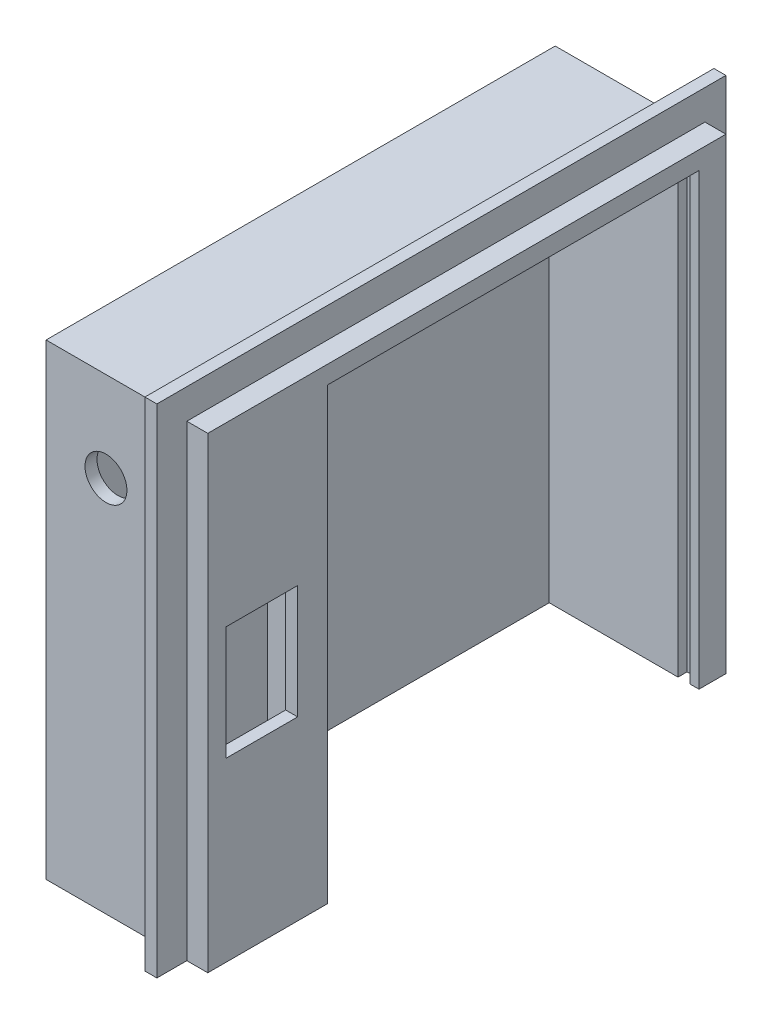
ISO-10303-21;
HEADER;
FILE_DESCRIPTION(('STEP AP214'),'2;1');
FILE_NAME('part.step','',(''),(''),'','','');
FILE_SCHEMA(('AUTOMOTIVE_DESIGN { 1 0 10303 214 1 1 1 1 }'));
ENDSEC;
DATA;
#1=APPLICATION_CONTEXT('core data for automotive mechanical design processes');
#2=APPLICATION_PROTOCOL_DEFINITION('international standard','automotive_design',2000,#1);
#3=PRODUCT_CONTEXT('',#1,'mechanical');
#4=PRODUCT('Part','Part','',(#3));
#5=PRODUCT_RELATED_PRODUCT_CATEGORY('part','',(#4));
#6=PRODUCT_DEFINITION_FORMATION('','',#4);
#7=PRODUCT_DEFINITION_CONTEXT('part definition',#1,'design');
#8=PRODUCT_DEFINITION('design','',#6,#7);
#9=PRODUCT_DEFINITION_SHAPE('','',#8);
#10=(LENGTH_UNIT() NAMED_UNIT(*) SI_UNIT(.MILLI.,.METRE.));
#11=(NAMED_UNIT(*) PLANE_ANGLE_UNIT() SI_UNIT($,.RADIAN.));
#12=(NAMED_UNIT(*) SI_UNIT($,.STERADIAN.) SOLID_ANGLE_UNIT());
#13=UNCERTAINTY_MEASURE_WITH_UNIT(LENGTH_MEASURE(1.E-05),#10,'distance_accuracy_value','');
#14=(GEOMETRIC_REPRESENTATION_CONTEXT(3) GLOBAL_UNCERTAINTY_ASSIGNED_CONTEXT((#13)) GLOBAL_UNIT_ASSIGNED_CONTEXT((#10,
#11,#12)) REPRESENTATION_CONTEXT('',''));
#15=CARTESIAN_POINT('',(0.,0.,0.));
#16=DIRECTION('',(0.,0.,1.));
#17=DIRECTION('',(1.,0.,0.));
#18=AXIS2_PLACEMENT_3D('',#15,#16,#17);
#19=CARTESIAN_POINT('',(23.5,0.,95.));
#20=DIRECTION('',(1.,0.,0.));
#21=DIRECTION('',(0.,0.,1.));
#22=AXIS2_PLACEMENT_3D('',#19,#20,#21);
#23=PLANE('',#22);
#24=DIRECTION('',(0.,0.,1.));
#25=VECTOR('',#24,1.);
#26=CARTESIAN_POINT('',(23.5,40.,52.5));
#27=LINE('',#26,#25);
#28=CARTESIAN_POINT('',(23.5,40.,51.));
#29=VERTEX_POINT('',#28);
#30=CARTESIAN_POINT('',(23.5,40.,137.5));
#31=VERTEX_POINT('',#30);
#32=EDGE_CURVE('E55',#29,#31,#27,.T.);
#33=ORIENTED_EDGE('',*,*,#32,.F.);
#34=DIRECTION('',(0.,1.,0.));
#35=VECTOR('',#34,1.);
#36=CARTESIAN_POINT('',(23.5,40.,51.));
#37=LINE('',#36,#35);
#38=CARTESIAN_POINT('',(23.5,-38.,51.));
#39=VERTEX_POINT('',#38);
#40=EDGE_CURVE('E276',#39,#29,#37,.T.);
#41=ORIENTED_EDGE('',*,*,#40,.F.);
#42=DIRECTION('',(0.,0.,1.));
#43=VECTOR('',#42,1.);
#44=CARTESIAN_POINT('',(23.5,-38.,47.5));
#45=LINE('',#44,#43);
#46=CARTESIAN_POINT('',(23.5,-38.,47.5));
#47=VERTEX_POINT('',#46);
#48=EDGE_CURVE('E288',#47,#39,#45,.T.);
#49=ORIENTED_EDGE('',*,*,#48,.F.);
#50=DIRECTION('',(0.,-1.,0.));
#51=VECTOR('',#50,1.);
#52=CARTESIAN_POINT('',(23.5,45.,47.5));
#53=LINE('',#52,#51);
#54=CARTESIAN_POINT('',(23.5,45.,47.5));
#55=VERTEX_POINT('',#54);
#56=EDGE_CURVE('E285',#55,#47,#53,.T.);
#57=ORIENTED_EDGE('',*,*,#56,.F.);
#58=DIRECTION('',(0.,0.,-1.));
#59=VECTOR('',#58,1.);
#60=CARTESIAN_POINT('',(23.5,45.,47.5));
#61=LINE('',#60,#59);
#62=CARTESIAN_POINT('',(23.5,45.,142.5));
#63=VERTEX_POINT('',#62);
#64=EDGE_CURVE('E299',#63,#55,#61,.T.);
#65=ORIENTED_EDGE('',*,*,#64,.F.);
#66=DIRECTION('',(0.,1.,0.));
#67=VECTOR('',#66,1.);
#68=CARTESIAN_POINT('',(23.5,45.,142.5));
#69=LINE('',#68,#67);
#70=CARTESIAN_POINT('',(23.5,-38.,142.5));
#71=VERTEX_POINT('',#70);
#72=EDGE_CURVE('E334',#71,#63,#69,.T.);
#73=ORIENTED_EDGE('',*,*,#72,.F.);
#74=DIRECTION('',(0.,0.,1.));
#75=VECTOR('',#74,1.);
#76=CARTESIAN_POINT('',(23.5,-38.,137.5));
#77=LINE('',#76,#75);
#78=CARTESIAN_POINT('',(23.5,-38.,137.5));
#79=VERTEX_POINT('',#78);
#80=EDGE_CURVE('E330',#79,#71,#77,.T.);
#81=ORIENTED_EDGE('',*,*,#80,.F.);
#82=DIRECTION('',(0.,-1.,0.));
#83=VECTOR('',#82,1.);
#84=CARTESIAN_POINT('',(23.5,40.,137.5));
#85=LINE('',#84,#83);
#86=EDGE_CURVE('E326',#31,#79,#85,.T.);
#87=ORIENTED_EDGE('',*,*,#86,.F.);
#88=EDGE_LOOP('',(#33,#41,#49,#57,#65,#73,#81,#87));
#89=FACE_BOUND('',#88,.T.);
#90=ADVANCED_FACE('F39',(#89),#23,.T.);
#91=CARTESIAN_POINT('',(27.,40.,137.5));
#92=DIRECTION('',(0.,0.,-1.));
#93=DIRECTION('',(0.,-1.,0.));
#94=AXIS2_PLACEMENT_3D('',#91,#92,#93);
#95=PLANE('',#94);
#96=CARTESIAN_POINT('',(10.,25.,137.5));
#97=DIRECTION('',(0.,0.,-1.));
#98=DIRECTION('',(0.,1.,0.));
#99=AXIS2_PLACEMENT_3D('',#96,#97,#98);
#100=CIRCLE('',#99,3.5);
#101=CARTESIAN_POINT('',(10.,28.5,137.5));
#102=VERTEX_POINT('',#101);
#103=EDGE_CURVE('E343',#102,#102,#100,.T.);
#104=ORIENTED_EDGE('',*,*,#103,.T.);
#105=EDGE_LOOP('',(#104));
#106=FACE_BOUND('',#105,.T.);
#107=DIRECTION('',(0.,-1.,0.));
#108=VECTOR('',#107,1.);
#109=CARTESIAN_POINT('',(21.5,40.,137.5));
#110=LINE('',#109,#108);
#111=CARTESIAN_POINT('',(21.5,40.,137.5));
#112=VERTEX_POINT('',#111);
#113=CARTESIAN_POINT('',(21.5,-38.,137.5));
#114=VERTEX_POINT('',#113);
#115=EDGE_CURVE('E307',#112,#114,#110,.T.);
#116=ORIENTED_EDGE('',*,*,#115,.F.);
#117=DIRECTION('',(-1.,0.,0.));
#118=VECTOR('',#117,1.);
#119=CARTESIAN_POINT('',(27.,40.,137.5));
#120=LINE('',#119,#118);
#121=CARTESIAN_POINT('',(0.,40.,137.5));
#122=VERTEX_POINT('',#121);
#123=EDGE_CURVE('E579',#112,#122,#120,.T.);
#124=ORIENTED_EDGE('',*,*,#123,.T.);
#125=DIRECTION('',(0.,1.,0.));
#126=VECTOR('',#125,1.);
#127=CARTESIAN_POINT('',(0.,40.,137.5));
#128=LINE('',#127,#126);
#129=CARTESIAN_POINT('',(0.,-38.,137.5));
#130=VERTEX_POINT('',#129);
#131=EDGE_CURVE('E526',#130,#122,#128,.T.);
#132=ORIENTED_EDGE('',*,*,#131,.F.);
#133=DIRECTION('',(1.,0.,0.));
#134=VECTOR('',#133,1.);
#135=CARTESIAN_POINT('',(0.,-38.,137.5));
#136=LINE('',#135,#134);
#137=EDGE_CURVE('E514',#130,#114,#136,.T.);
#138=ORIENTED_EDGE('',*,*,#137,.T.);
#139=EDGE_LOOP('',(#116,#124,#132,#138));
#140=FACE_BOUND('',#139,.T.);
#141=ADVANCED_FACE('F640',(#106,#140),#95,.F.);
#142=CARTESIAN_POINT('',(27.,40.,52.5));
#143=DIRECTION('',(0.,-1.,0.));
#144=DIRECTION('',(0.,0.,1.));
#145=AXIS2_PLACEMENT_3D('',#142,#143,#144);
#146=PLANE('',#145);
#147=DIRECTION('',(0.,0.,1.));
#148=VECTOR('',#147,1.);
#149=CARTESIAN_POINT('',(21.5,40.,52.5));
#150=LINE('',#149,#148);
#151=CARTESIAN_POINT('',(21.5,40.,52.5));
#152=VERTEX_POINT('',#151);
#153=EDGE_CURVE('E63',#152,#112,#150,.T.);
#154=ORIENTED_EDGE('',*,*,#153,.F.);
#155=DIRECTION('',(-1.,0.,0.));
#156=VECTOR('',#155,1.);
#157=CARTESIAN_POINT('',(27.,40.,52.5));
#158=LINE('',#157,#156);
#159=CARTESIAN_POINT('',(0.,40.,52.5));
#160=VERTEX_POINT('',#159);
#161=EDGE_CURVE('E268',#152,#160,#158,.T.);
#162=ORIENTED_EDGE('',*,*,#161,.T.);
#163=DIRECTION('',(0.,0.,-1.));
#164=VECTOR('',#163,1.);
#165=CARTESIAN_POINT('',(0.,40.,52.5));
#166=LINE('',#165,#164);
#167=EDGE_CURVE('E569',#122,#160,#166,.T.);
#168=ORIENTED_EDGE('',*,*,#167,.F.);
#169=ORIENTED_EDGE('',*,*,#123,.F.);
#170=EDGE_LOOP('',(#154,#162,#168,#169));
#171=FACE_BOUND('',#170,.T.);
#172=ADVANCED_FACE('F647',(#171),#146,.F.);
#173=CARTESIAN_POINT('',(27.,40.,52.5));
#174=DIRECTION('',(0.,0.,1.));
#175=DIRECTION('',(-1.,0.,0.));
#176=AXIS2_PLACEMENT_3D('',#173,#174,#175);
#177=PLANE('',#176);
#178=DIRECTION('',(0.,1.,0.));
#179=VECTOR('',#178,1.);
#180=CARTESIAN_POINT('',(21.5,-38.,52.5));
#181=LINE('',#180,#179);
#182=CARTESIAN_POINT('',(21.5,-38.,52.5));
#183=VERTEX_POINT('',#182);
#184=EDGE_CURVE('E302',#183,#152,#181,.T.);
#185=ORIENTED_EDGE('',*,*,#184,.F.);
#186=DIRECTION('',(1.,0.,0.));
#187=VECTOR('',#186,1.);
#188=CARTESIAN_POINT('',(0.,-38.,52.5));
#189=LINE('',#188,#187);
#190=CARTESIAN_POINT('',(0.,-38.,52.5));
#191=VERTEX_POINT('',#190);
#192=EDGE_CURVE('E509',#191,#183,#189,.T.);
#193=ORIENTED_EDGE('',*,*,#192,.F.);
#194=DIRECTION('',(0.,-1.,0.));
#195=VECTOR('',#194,1.);
#196=CARTESIAN_POINT('',(0.,40.,52.5));
#197=LINE('',#196,#195);
#198=EDGE_CURVE('E564',#160,#191,#197,.T.);
#199=ORIENTED_EDGE('',*,*,#198,.F.);
#200=ORIENTED_EDGE('',*,*,#161,.F.);
#201=EDGE_LOOP('',(#185,#193,#199,#200));
#202=FACE_BOUND('',#201,.T.);
#203=ADVANCED_FACE('F738',(#202),#177,.F.);
#204=CARTESIAN_POINT('',(27.,40.,117.5));
#205=DIRECTION('',(0.,0.,-1.));
#206=DIRECTION('',(0.,-1.,0.));
#207=AXIS2_PLACEMENT_3D('',#204,#205,#206);
#208=PLANE('',#207);
#209=DIRECTION('',(-1.,0.,0.));
#210=VECTOR('',#209,1.);
#211=CARTESIAN_POINT('',(27.,-38.,117.5));
#212=LINE('',#211,#210);
#213=CARTESIAN_POINT('',(23.5,-38.,117.5));
#214=VERTEX_POINT('',#213);
#215=CARTESIAN_POINT('',(2.,-38.,117.5));
#216=VERTEX_POINT('',#215);
#217=EDGE_CURVE('E533',#214,#216,#212,.T.);
#218=ORIENTED_EDGE('',*,*,#217,.T.);
#219=DIRECTION('',(0.,1.,0.));
#220=VECTOR('',#219,1.);
#221=CARTESIAN_POINT('',(2.,40.,117.5));
#222=LINE('',#221,#220);
#223=CARTESIAN_POINT('',(2.,-36.,117.5));
#224=VERTEX_POINT('',#223);
#225=EDGE_CURVE('E513',#216,#224,#222,.T.);
#226=ORIENTED_EDGE('',*,*,#225,.T.);
#227=DIRECTION('',(-1.,0.,0.));
#228=VECTOR('',#227,1.);
#229=CARTESIAN_POINT('',(27.,-36.,117.5));
#230=LINE('',#229,#228);
#231=CARTESIAN_POINT('',(20.,-36.,117.5));
#232=VERTEX_POINT('',#231);
#233=EDGE_CURVE('E483',#232,#224,#230,.T.);
#234=ORIENTED_EDGE('',*,*,#233,.F.);
#235=DIRECTION('',(0.,-1.,0.));
#236=VECTOR('',#235,1.);
#237=CARTESIAN_POINT('',(20.,37.,117.5));
#238=LINE('',#237,#236);
#239=CARTESIAN_POINT('',(20.,37.,117.5));
#240=VERTEX_POINT('',#239);
#241=EDGE_CURVE('E456',#240,#232,#238,.T.);
#242=ORIENTED_EDGE('',*,*,#241,.F.);
#243=DIRECTION('',(-1.,0.,0.));
#244=VECTOR('',#243,1.);
#245=CARTESIAN_POINT('',(27.,37.,117.5));
#246=LINE('',#245,#244);
#247=CARTESIAN_POINT('',(23.5,37.,117.5));
#248=VERTEX_POINT('',#247);
#249=EDGE_CURVE('E527',#248,#240,#246,.T.);
#250=ORIENTED_EDGE('',*,*,#249,.F.);
#251=DIRECTION('',(0.,1.,0.));
#252=VECTOR('',#251,1.);
#253=CARTESIAN_POINT('',(23.5,40.,117.5));
#254=LINE('',#253,#252);
#255=EDGE_CURVE('E440',#214,#248,#254,.T.);
#256=ORIENTED_EDGE('',*,*,#255,.F.);
#257=EDGE_LOOP('',(#218,#226,#234,#242,#250,#256));
#258=FACE_BOUND('',#257,.T.);
#259=ADVANCED_FACE('F719',(#258),#208,.T.);
#260=CARTESIAN_POINT('',(27.,37.,52.5));
#261=DIRECTION('',(0.,-1.,0.));
#262=DIRECTION('',(0.,0.,1.));
#263=AXIS2_PLACEMENT_3D('',#260,#261,#262);
#264=PLANE('',#263);
#265=ORIENTED_EDGE('',*,*,#249,.T.);
#266=DIRECTION('',(0.,0.,-1.));
#267=VECTOR('',#266,1.);
#268=CARTESIAN_POINT('',(20.,37.,117.5));
#269=LINE('',#268,#267);
#270=CARTESIAN_POINT('',(20.,37.,120.5));
#271=VERTEX_POINT('',#270);
#272=EDGE_CURVE('E463',#271,#240,#269,.T.);
#273=ORIENTED_EDGE('',*,*,#272,.F.);
#274=DIRECTION('',(1.,0.,0.));
#275=VECTOR('',#274,1.);
#276=CARTESIAN_POINT('',(20.,37.,120.5));
#277=LINE('',#276,#275);
#278=CARTESIAN_POINT('',(25.,37.,120.5));
#279=VERTEX_POINT('',#278);
#280=EDGE_CURVE('E466',#271,#279,#277,.T.);
#281=ORIENTED_EDGE('',*,*,#280,.T.);
#282=DIRECTION('',(0.,0.,-1.));
#283=VECTOR('',#282,1.);
#284=CARTESIAN_POINT('',(25.,37.,52.5));
#285=LINE('',#284,#283);
#286=CARTESIAN_POINT('',(25.,37.,135.5));
#287=VERTEX_POINT('',#286);
#288=EDGE_CURVE('E477',#287,#279,#285,.T.);
#289=ORIENTED_EDGE('',*,*,#288,.F.);
#290=DIRECTION('',(-1.,0.,0.));
#291=VECTOR('',#290,1.);
#292=CARTESIAN_POINT('',(27.,37.,135.5));
#293=LINE('',#292,#291);
#294=CARTESIAN_POINT('',(2.,37.,135.5));
#295=VERTEX_POINT('',#294);
#296=EDGE_CURVE('E487',#287,#295,#293,.T.);
#297=ORIENTED_EDGE('',*,*,#296,.T.);
#298=DIRECTION('',(0.,0.,-1.));
#299=VECTOR('',#298,1.);
#300=CARTESIAN_POINT('',(2.,37.,52.5));
#301=LINE('',#300,#299);
#302=CARTESIAN_POINT('',(2.,37.,55.5));
#303=VERTEX_POINT('',#302);
#304=EDGE_CURVE('E521',#295,#303,#301,.T.);
#305=ORIENTED_EDGE('',*,*,#304,.T.);
#306=DIRECTION('',(-1.,0.,0.));
#307=VECTOR('',#306,1.);
#308=CARTESIAN_POINT('',(27.,37.,55.5));
#309=LINE('',#308,#307);
#310=CARTESIAN_POINT('',(23.5,37.,55.5));
#311=VERTEX_POINT('',#310);
#312=EDGE_CURVE('E542',#311,#303,#309,.T.);
#313=ORIENTED_EDGE('',*,*,#312,.F.);
#314=DIRECTION('',(0.,0.,-1.));
#315=VECTOR('',#314,1.);
#316=CARTESIAN_POINT('',(23.5,37.,52.5));
#317=LINE('',#316,#315);
#318=EDGE_CURVE('E436',#248,#311,#317,.T.);
#319=ORIENTED_EDGE('',*,*,#318,.F.);
#320=EDGE_LOOP('',(#265,#273,#281,#289,#297,#305,#313,#319));
#321=FACE_BOUND('',#320,.T.);
#322=ADVANCED_FACE('F726',(#321),#264,.T.);
#323=CARTESIAN_POINT('',(27.,40.,55.5));
#324=DIRECTION('',(0.,0.,1.));
#325=DIRECTION('',(-1.,0.,0.));
#326=AXIS2_PLACEMENT_3D('',#323,#324,#325);
#327=PLANE('',#326);
#328=ORIENTED_EDGE('',*,*,#312,.T.);
#329=DIRECTION('',(0.,-1.,0.));
#330=VECTOR('',#329,1.);
#331=CARTESIAN_POINT('',(2.,40.,55.5));
#332=LINE('',#331,#330);
#333=CARTESIAN_POINT('',(2.,-38.,55.5));
#334=VERTEX_POINT('',#333);
#335=EDGE_CURVE('E537',#303,#334,#332,.T.);
#336=ORIENTED_EDGE('',*,*,#335,.T.);
#337=DIRECTION('',(-1.,0.,0.));
#338=VECTOR('',#337,1.);
#339=CARTESIAN_POINT('',(27.,-38.,55.5));
#340=LINE('',#339,#338);
#341=CARTESIAN_POINT('',(23.5,-38.,55.5));
#342=VERTEX_POINT('',#341);
#343=EDGE_CURVE('E532',#342,#334,#340,.T.);
#344=ORIENTED_EDGE('',*,*,#343,.F.);
#345=DIRECTION('',(0.,-1.,0.));
#346=VECTOR('',#345,1.);
#347=CARTESIAN_POINT('',(23.5,40.,55.5));
#348=LINE('',#347,#346);
#349=EDGE_CURVE('E432',#311,#342,#348,.T.);
#350=ORIENTED_EDGE('',*,*,#349,.F.);
#351=EDGE_LOOP('',(#328,#336,#344,#350));
#352=FACE_BOUND('',#351,.T.);
#353=ADVANCED_FACE('F717',(#352),#327,.T.);
#354=DIRECTION('',(0.,1.,0.));
#355=VECTOR('',#354,1.);
#356=CARTESIAN_POINT('',(25.5,40.,117.5));
#357=LINE('',#356,#355);
#358=CARTESIAN_POINT('',(25.5,-38.,117.5));
#359=VERTEX_POINT('',#358);
#360=CARTESIAN_POINT('',(25.5,37.,117.5));
#361=VERTEX_POINT('',#360);
#362=EDGE_CURVE('E452',#359,#361,#357,.T.);
#363=ORIENTED_EDGE('',*,*,#362,.T.);
#364=CARTESIAN_POINT('',(27.,37.,117.5));
#365=VERTEX_POINT('',#364);
#366=EDGE_CURVE('E522',#365,#361,#246,.T.);
#367=ORIENTED_EDGE('',*,*,#366,.F.);
#368=DIRECTION('',(0.,1.,0.));
#369=VECTOR('',#368,1.);
#370=CARTESIAN_POINT('',(27.,40.,117.5));
#371=LINE('',#370,#369);
#372=CARTESIAN_POINT('',(27.,-38.,117.5));
#373=VERTEX_POINT('',#372);
#374=EDGE_CURVE('E553',#373,#365,#371,.T.);
#375=ORIENTED_EDGE('',*,*,#374,.F.);
#376=EDGE_CURVE('E528',#373,#359,#212,.T.);
#377=ORIENTED_EDGE('',*,*,#376,.T.);
#378=EDGE_LOOP('',(#363,#367,#375,#377));
#379=FACE_BOUND('',#378,.T.);
#380=ADVANCED_FACE('F714',(#379),#208,.T.);
#381=CARTESIAN_POINT('',(27.,-38.,137.5));
#382=VERTEX_POINT('',#381);
#383=EDGE_CURVE('E505',#79,#382,#136,.T.);
#384=ORIENTED_EDGE('',*,*,#383,.T.);
#385=DIRECTION('',(0.,1.,0.));
#386=VECTOR('',#385,1.);
#387=CARTESIAN_POINT('',(27.,40.,137.5));
#388=LINE('',#387,#386);
#389=CARTESIAN_POINT('',(27.,40.,137.5));
#390=VERTEX_POINT('',#389);
#391=EDGE_CURVE('E269',#382,#390,#388,.T.);
#392=ORIENTED_EDGE('',*,*,#391,.T.);
#393=EDGE_CURVE('E262',#390,#31,#120,.T.);
#394=ORIENTED_EDGE('',*,*,#393,.T.);
#395=ORIENTED_EDGE('',*,*,#86,.T.);
#396=EDGE_LOOP('',(#384,#392,#394,#395));
#397=FACE_BOUND('',#396,.T.);
#398=ADVANCED_FACE('F41',(#397),#95,.F.);
#399=ORIENTED_EDGE('',*,*,#393,.F.);
#400=DIRECTION('',(0.,0.,-1.));
#401=VECTOR('',#400,1.);
#402=CARTESIAN_POINT('',(27.,40.,52.5));
#403=LINE('',#402,#401);
#404=CARTESIAN_POINT('',(27.,40.,51.));
#405=VERTEX_POINT('',#404);
#406=EDGE_CURVE('E257',#390,#405,#403,.T.);
#407=ORIENTED_EDGE('',*,*,#406,.T.);
#408=DIRECTION('',(-1.,0.,0.));
#409=VECTOR('',#408,1.);
#410=CARTESIAN_POINT('',(105.014421743675,40.,51.));
#411=LINE('',#410,#409);
#412=EDGE_CURVE('E260',#405,#29,#411,.T.);
#413=ORIENTED_EDGE('',*,*,#412,.T.);
#414=ORIENTED_EDGE('',*,*,#32,.T.);
#415=EDGE_LOOP('',(#399,#407,#413,#414));
#416=FACE_BOUND('',#415,.T.);
#417=ADVANCED_FACE('F259',(#416),#146,.F.);
#418=CARTESIAN_POINT('',(27.,0.,95.));
#419=DIRECTION('',(1.,0.,0.));
#420=DIRECTION('',(0.,0.,1.));
#421=AXIS2_PLACEMENT_3D('',#418,#419,#420);
#422=PLANE('',#421);
#423=DIRECTION('',(0.,-1.,0.));
#424=VECTOR('',#423,1.);
#425=CARTESIAN_POINT('',(27.,10.5,122.5));
#426=LINE('',#425,#424);
#427=CARTESIAN_POINT('',(27.,10.5,122.5));
#428=VERTEX_POINT('',#427);
#429=CARTESIAN_POINT('',(27.,-8.50000000000001,122.5));
#430=VERTEX_POINT('',#429);
#431=EDGE_CURVE('E359',#428,#430,#426,.T.);
#432=ORIENTED_EDGE('',*,*,#431,.T.);
#433=DIRECTION('',(0.,0.,1.));
#434=VECTOR('',#433,1.);
#435=CARTESIAN_POINT('',(27.,-8.50000000000001,122.5));
#436=LINE('',#435,#434);
#437=CARTESIAN_POINT('',(27.,-8.50000000000001,134.5));
#438=VERTEX_POINT('',#437);
#439=EDGE_CURVE('E366',#430,#438,#436,.T.);
#440=ORIENTED_EDGE('',*,*,#439,.T.);
#441=DIRECTION('',(0.,1.,0.));
#442=VECTOR('',#441,1.);
#443=CARTESIAN_POINT('',(27.,10.5,134.5));
#444=LINE('',#443,#442);
#445=CARTESIAN_POINT('',(27.,10.5,134.5));
#446=VERTEX_POINT('',#445);
#447=EDGE_CURVE('E370',#438,#446,#444,.T.);
#448=ORIENTED_EDGE('',*,*,#447,.T.);
#449=DIRECTION('',(0.,0.,-1.));
#450=VECTOR('',#449,1.);
#451=CARTESIAN_POINT('',(27.,10.5,122.5));
#452=LINE('',#451,#450);
#453=EDGE_CURVE('E374',#446,#428,#452,.T.);
#454=ORIENTED_EDGE('',*,*,#453,.T.);
#455=EDGE_LOOP('',(#432,#440,#448,#454));
#456=FACE_BOUND('',#455,.T.);
#457=DIRECTION('',(0.,0.,-1.));
#458=VECTOR('',#457,1.);
#459=CARTESIAN_POINT('',(27.,37.,52.5));
#460=LINE('',#459,#458);
#461=CARTESIAN_POINT('',(27.,37.,55.5));
#462=VERTEX_POINT('',#461);
#463=EDGE_CURVE('E557',#365,#462,#460,.T.);
#464=ORIENTED_EDGE('',*,*,#463,.T.);
#465=DIRECTION('',(0.,-1.,0.));
#466=VECTOR('',#465,1.);
#467=CARTESIAN_POINT('',(27.,40.,55.5));
#468=LINE('',#467,#466);
#469=CARTESIAN_POINT('',(27.,-38.,55.5));
#470=VERTEX_POINT('',#469);
#471=EDGE_CURVE('E560',#462,#470,#468,.T.);
#472=ORIENTED_EDGE('',*,*,#471,.T.);
#473=DIRECTION('',(0.,0.,-1.));
#474=VECTOR('',#473,1.);
#475=CARTESIAN_POINT('',(27.,-38.,52.5));
#476=LINE('',#475,#474);
#477=CARTESIAN_POINT('',(27.,-38.,51.));
#478=VERTEX_POINT('',#477);
#479=EDGE_CURVE('E283',#470,#478,#476,.T.);
#480=ORIENTED_EDGE('',*,*,#479,.T.);
#481=DIRECTION('',(0.,1.,0.));
#482=VECTOR('',#481,1.);
#483=CARTESIAN_POINT('',(27.,40.,51.));
#484=LINE('',#483,#482);
#485=EDGE_CURVE('E274',#478,#405,#484,.T.);
#486=ORIENTED_EDGE('',*,*,#485,.T.);
#487=ORIENTED_EDGE('',*,*,#406,.F.);
#488=ORIENTED_EDGE('',*,*,#391,.F.);
#489=EDGE_CURVE('E506',#382,#373,#476,.T.);
#490=ORIENTED_EDGE('',*,*,#489,.T.);
#491=ORIENTED_EDGE('',*,*,#374,.T.);
#492=EDGE_LOOP('',(#464,#472,#480,#486,#487,#488,#490,#491));
#493=FACE_BOUND('',#492,.T.);
#494=ADVANCED_FACE('F280',(#456,#493),#422,.T.);
#495=CARTESIAN_POINT('',(0.,0.,95.));
#496=DIRECTION('',(1.,0.,0.));
#497=DIRECTION('',(0.,0.,1.));
#498=AXIS2_PLACEMENT_3D('',#495,#496,#497);
#499=PLANE('',#498);
#500=ORIENTED_EDGE('',*,*,#131,.T.);
#501=ORIENTED_EDGE('',*,*,#167,.T.);
#502=ORIENTED_EDGE('',*,*,#198,.T.);
#503=DIRECTION('',(0.,0.,-1.));
#504=VECTOR('',#503,1.);
#505=CARTESIAN_POINT('',(0.,-38.,52.5));
#506=LINE('',#505,#504);
#507=EDGE_CURVE('E502',#130,#191,#506,.T.);
#508=ORIENTED_EDGE('',*,*,#507,.F.);
#509=EDGE_LOOP('',(#500,#501,#502,#508));
#510=FACE_BOUND('',#509,.T.);
#511=ADVANCED_FACE('F724',(#510),#499,.F.);
#512=DIRECTION('',(0.,0.,-1.));
#513=VECTOR('',#512,1.);
#514=CARTESIAN_POINT('',(25.5,37.,52.5));
#515=LINE('',#514,#513);
#516=CARTESIAN_POINT('',(25.5,37.,55.5));
#517=VERTEX_POINT('',#516);
#518=EDGE_CURVE('E448',#361,#517,#515,.T.);
#519=ORIENTED_EDGE('',*,*,#518,.T.);
#520=EDGE_CURVE('E538',#462,#517,#309,.T.);
#521=ORIENTED_EDGE('',*,*,#520,.F.);
#522=ORIENTED_EDGE('',*,*,#463,.F.);
#523=ORIENTED_EDGE('',*,*,#366,.T.);
#524=EDGE_LOOP('',(#519,#521,#522,#523));
#525=FACE_BOUND('',#524,.T.);
#526=ADVANCED_FACE('F720',(#525),#264,.T.);
#527=DIRECTION('',(0.,-1.,0.));
#528=VECTOR('',#527,1.);
#529=CARTESIAN_POINT('',(25.5,40.,55.5));
#530=LINE('',#529,#528);
#531=CARTESIAN_POINT('',(25.5,-38.,55.5));
#532=VERTEX_POINT('',#531);
#533=EDGE_CURVE('E444',#517,#532,#530,.T.);
#534=ORIENTED_EDGE('',*,*,#533,.T.);
#535=EDGE_CURVE('E547',#470,#532,#340,.T.);
#536=ORIENTED_EDGE('',*,*,#535,.F.);
#537=ORIENTED_EDGE('',*,*,#471,.F.);
#538=ORIENTED_EDGE('',*,*,#520,.T.);
#539=EDGE_LOOP('',(#534,#536,#537,#538));
#540=FACE_BOUND('',#539,.T.);
#541=ADVANCED_FACE('F723',(#540),#327,.T.);
#542=CARTESIAN_POINT('',(2.,0.,95.));
#543=DIRECTION('',(1.,0.,0.));
#544=DIRECTION('',(0.,0.,1.));
#545=AXIS2_PLACEMENT_3D('',#542,#543,#544);
#546=PLANE('',#545);
#547=ORIENTED_EDGE('',*,*,#225,.F.);
#548=DIRECTION('',(0.,0.,1.));
#549=VECTOR('',#548,1.);
#550=CARTESIAN_POINT('',(2.,-38.,52.5));
#551=LINE('',#550,#549);
#552=EDGE_CURVE('E546',#334,#216,#551,.T.);
#553=ORIENTED_EDGE('',*,*,#552,.F.);
#554=ORIENTED_EDGE('',*,*,#335,.F.);
#555=ORIENTED_EDGE('',*,*,#304,.F.);
#556=DIRECTION('',(0.,1.,0.));
#557=VECTOR('',#556,1.);
#558=CARTESIAN_POINT('',(2.,40.,135.5));
#559=LINE('',#558,#557);
#560=CARTESIAN_POINT('',(2.,-36.,135.5));
#561=VERTEX_POINT('',#560);
#562=EDGE_CURVE('E478',#561,#295,#559,.T.);
#563=ORIENTED_EDGE('',*,*,#562,.F.);
#564=DIRECTION('',(0.,0.,-1.));
#565=VECTOR('',#564,1.);
#566=CARTESIAN_POINT('',(2.,-36.,95.));
#567=LINE('',#566,#565);
#568=EDGE_CURVE('E484',#561,#224,#567,.T.);
#569=ORIENTED_EDGE('',*,*,#568,.T.);
#570=EDGE_LOOP('',(#547,#553,#554,#555,#563,#569));
#571=FACE_BOUND('',#570,.T.);
#572=ADVANCED_FACE('F712',(#571),#546,.T.);
#573=CARTESIAN_POINT('',(0.,-38.,52.5));
#574=DIRECTION('',(0.,1.,0.));
#575=DIRECTION('',(0.,0.,-1.));
#576=AXIS2_PLACEMENT_3D('',#573,#574,#575);
#577=PLANE('',#576);
#578=DIRECTION('',(-1.,0.,0.));
#579=VECTOR('',#578,1.);
#580=CARTESIAN_POINT('',(105.014421743675,-38.,51.));
#581=LINE('',#580,#579);
#582=EDGE_CURVE('E292',#478,#39,#581,.T.);
#583=ORIENTED_EDGE('',*,*,#582,.F.);
#584=ORIENTED_EDGE('',*,*,#479,.F.);
#585=ORIENTED_EDGE('',*,*,#535,.T.);
#586=DIRECTION('',(0.,0.,1.));
#587=VECTOR('',#586,1.);
#588=CARTESIAN_POINT('',(25.5,-38.,54.));
#589=LINE('',#588,#587);
#590=CARTESIAN_POINT('',(25.5,-38.,54.));
#591=VERTEX_POINT('',#590);
#592=EDGE_CURVE('E394',#591,#532,#589,.T.);
#593=ORIENTED_EDGE('',*,*,#592,.F.);
#594=DIRECTION('',(-1.,0.,0.));
#595=VECTOR('',#594,1.);
#596=CARTESIAN_POINT('',(25.5,-38.,54.));
#597=LINE('',#596,#595);
#598=CARTESIAN_POINT('',(23.5,-38.,54.));
#599=VERTEX_POINT('',#598);
#600=EDGE_CURVE('E428',#591,#599,#597,.T.);
#601=ORIENTED_EDGE('',*,*,#600,.T.);
#602=DIRECTION('',(0.,0.,1.));
#603=VECTOR('',#602,1.);
#604=CARTESIAN_POINT('',(23.5,-38.,54.));
#605=LINE('',#604,#603);
#606=EDGE_CURVE('E408',#599,#342,#605,.T.);
#607=ORIENTED_EDGE('',*,*,#606,.T.);
#608=ORIENTED_EDGE('',*,*,#343,.T.);
#609=ORIENTED_EDGE('',*,*,#552,.T.);
#610=ORIENTED_EDGE('',*,*,#217,.F.);
#611=DIRECTION('',(0.,0.,1.));
#612=VECTOR('',#611,1.);
#613=CARTESIAN_POINT('',(23.5,-38.,52.5));
#614=LINE('',#613,#612);
#615=CARTESIAN_POINT('',(23.5,-38.,119.));
#616=VERTEX_POINT('',#615);
#617=EDGE_CURVE('E590',#214,#616,#614,.T.);
#618=ORIENTED_EDGE('',*,*,#617,.T.);
#619=DIRECTION('',(-1.,0.,0.));
#620=VECTOR('',#619,1.);
#621=CARTESIAN_POINT('',(25.5,-38.,119.));
#622=LINE('',#621,#620);
#623=CARTESIAN_POINT('',(25.5,-38.,119.));
#624=VERTEX_POINT('',#623);
#625=EDGE_CURVE('E424',#624,#616,#622,.T.);
#626=ORIENTED_EDGE('',*,*,#625,.F.);
#627=DIRECTION('',(0.,0.,1.));
#628=VECTOR('',#627,1.);
#629=CARTESIAN_POINT('',(25.5,-38.,52.5));
#630=LINE('',#629,#628);
#631=EDGE_CURVE('E594',#359,#624,#630,.T.);
#632=ORIENTED_EDGE('',*,*,#631,.F.);
#633=ORIENTED_EDGE('',*,*,#376,.F.);
#634=ORIENTED_EDGE('',*,*,#489,.F.);
#635=ORIENTED_EDGE('',*,*,#383,.F.);
#636=ORIENTED_EDGE('',*,*,#80,.T.);
#637=DIRECTION('',(1.,0.,0.));
#638=VECTOR('',#637,1.);
#639=CARTESIAN_POINT('',(21.5,-38.,142.5));
#640=LINE('',#639,#638);
#641=CARTESIAN_POINT('',(21.5,-38.,142.5));
#642=VERTEX_POINT('',#641);
#643=EDGE_CURVE('E348',#642,#71,#640,.T.);
#644=ORIENTED_EDGE('',*,*,#643,.F.);
#645=DIRECTION('',(0.,0.,1.));
#646=VECTOR('',#645,1.);
#647=CARTESIAN_POINT('',(21.5,-38.,137.5));
#648=LINE('',#647,#646);
#649=EDGE_CURVE('E310',#114,#642,#648,.T.);
#650=ORIENTED_EDGE('',*,*,#649,.F.);
#651=ORIENTED_EDGE('',*,*,#137,.F.);
#652=ORIENTED_EDGE('',*,*,#507,.T.);
#653=ORIENTED_EDGE('',*,*,#192,.T.);
#654=DIRECTION('',(0.,0.,1.));
#655=VECTOR('',#654,1.);
#656=CARTESIAN_POINT('',(21.5,-38.,47.5));
#657=LINE('',#656,#655);
#658=CARTESIAN_POINT('',(21.5,-38.,47.5));
#659=VERTEX_POINT('',#658);
#660=EDGE_CURVE('E298',#659,#183,#657,.T.);
#661=ORIENTED_EDGE('',*,*,#660,.F.);
#662=DIRECTION('',(1.,0.,0.));
#663=VECTOR('',#662,1.);
#664=CARTESIAN_POINT('',(21.5,-38.,47.5));
#665=LINE('',#664,#663);
#666=EDGE_CURVE('E319',#659,#47,#665,.T.);
#667=ORIENTED_EDGE('',*,*,#666,.T.);
#668=ORIENTED_EDGE('',*,*,#48,.T.);
#669=EDGE_LOOP('',(#583,#584,#585,#593,#601,#607,#608,#609,#610,#618,#626,#632,#633,#634,#635,
#636,#644,#650,#651,#652,#653,#661,#667,#668));
#670=FACE_BOUND('',#669,.T.);
#671=ADVANCED_FACE('F703',(#670),#577,.F.);
#672=CARTESIAN_POINT('',(27.,40.,135.5));
#673=DIRECTION('',(0.,0.,-1.));
#674=DIRECTION('',(0.,-1.,0.));
#675=AXIS2_PLACEMENT_3D('',#672,#673,#674);
#676=PLANE('',#675);
#677=CARTESIAN_POINT('',(10.,25.,135.5));
#678=DIRECTION('',(0.,0.,1.));
#679=DIRECTION('',(0.,-1.,0.));
#680=AXIS2_PLACEMENT_3D('',#677,#678,#679);
#681=CIRCLE('',#680,3.5);
#682=CARTESIAN_POINT('',(10.,21.5,135.5));
#683=VERTEX_POINT('',#682);
#684=EDGE_CURVE('E355',#683,#683,#681,.F.);
#685=ORIENTED_EDGE('',*,*,#684,.F.);
#686=EDGE_LOOP('',(#685));
#687=FACE_BOUND('',#686,.T.);
#688=DIRECTION('',(0.,1.,0.));
#689=VECTOR('',#688,1.);
#690=CARTESIAN_POINT('',(25.,40.,135.5));
#691=LINE('',#690,#689);
#692=CARTESIAN_POINT('',(25.,-36.,135.5));
#693=VERTEX_POINT('',#692);
#694=EDGE_CURVE('E474',#693,#287,#691,.T.);
#695=ORIENTED_EDGE('',*,*,#694,.F.);
#696=DIRECTION('',(1.,0.,0.));
#697=VECTOR('',#696,1.);
#698=CARTESIAN_POINT('',(0.,-36.,135.5));
#699=LINE('',#698,#697);
#700=EDGE_CURVE('E479',#561,#693,#699,.T.);
#701=ORIENTED_EDGE('',*,*,#700,.F.);
#702=ORIENTED_EDGE('',*,*,#562,.T.);
#703=ORIENTED_EDGE('',*,*,#296,.F.);
#704=EDGE_LOOP('',(#695,#701,#702,#703));
#705=FACE_BOUND('',#704,.T.);
#706=ADVANCED_FACE('F700',(#687,#705),#676,.T.);
#707=CARTESIAN_POINT('',(25.,0.,95.));
#708=DIRECTION('',(1.,0.,0.));
#709=DIRECTION('',(0.,0.,1.));
#710=AXIS2_PLACEMENT_3D('',#707,#708,#709);
#711=PLANE('',#710);
#712=DIRECTION('',(0.,0.,-1.));
#713=VECTOR('',#712,1.);
#714=CARTESIAN_POINT('',(25.,10.5,95.));
#715=LINE('',#714,#713);
#716=CARTESIAN_POINT('',(25.,10.5,134.5));
#717=VERTEX_POINT('',#716);
#718=CARTESIAN_POINT('',(25.,10.5,122.5));
#719=VERTEX_POINT('',#718);
#720=EDGE_CURVE('E48',#717,#719,#715,.T.);
#721=ORIENTED_EDGE('',*,*,#720,.F.);
#722=DIRECTION('',(0.,1.,0.));
#723=VECTOR('',#722,1.);
#724=CARTESIAN_POINT('',(25.,0.,134.5));
#725=LINE('',#724,#723);
#726=CARTESIAN_POINT('',(25.,-8.50000000000001,134.5));
#727=VERTEX_POINT('',#726);
#728=EDGE_CURVE('E602',#727,#717,#725,.T.);
#729=ORIENTED_EDGE('',*,*,#728,.F.);
#730=DIRECTION('',(0.,0.,1.));
#731=VECTOR('',#730,1.);
#732=CARTESIAN_POINT('',(25.,-8.50000000000001,95.));
#733=LINE('',#732,#731);
#734=CARTESIAN_POINT('',(25.,-8.50000000000001,122.5));
#735=VERTEX_POINT('',#734);
#736=EDGE_CURVE('E598',#735,#727,#733,.T.);
#737=ORIENTED_EDGE('',*,*,#736,.F.);
#738=DIRECTION('',(0.,-1.,0.));
#739=VECTOR('',#738,1.);
#740=CARTESIAN_POINT('',(25.,0.,122.5));
#741=LINE('',#740,#739);
#742=EDGE_CURVE('E11',#719,#735,#741,.T.);
#743=ORIENTED_EDGE('',*,*,#742,.F.);
#744=EDGE_LOOP('',(#721,#729,#737,#743));
#745=FACE_BOUND('',#744,.T.);
#746=DIRECTION('',(0.,0.,-1.));
#747=VECTOR('',#746,1.);
#748=CARTESIAN_POINT('',(25.,-36.,95.));
#749=LINE('',#748,#747);
#750=CARTESIAN_POINT('',(25.,-36.,120.5));
#751=VERTEX_POINT('',#750);
#752=EDGE_CURVE('E473',#693,#751,#749,.T.);
#753=ORIENTED_EDGE('',*,*,#752,.F.);
#754=ORIENTED_EDGE('',*,*,#694,.T.);
#755=ORIENTED_EDGE('',*,*,#288,.T.);
#756=DIRECTION('',(0.,1.,0.));
#757=VECTOR('',#756,1.);
#758=CARTESIAN_POINT('',(25.,0.,120.5));
#759=LINE('',#758,#757);
#760=EDGE_CURVE('E470',#751,#279,#759,.T.);
#761=ORIENTED_EDGE('',*,*,#760,.F.);
#762=EDGE_LOOP('',(#753,#754,#755,#761));
#763=FACE_BOUND('',#762,.T.);
#764=ADVANCED_FACE('F614',(#745,#763),#711,.F.);
#765=CARTESIAN_POINT('',(0.,-36.,52.5));
#766=DIRECTION('',(0.,1.,0.));
#767=DIRECTION('',(0.,0.,-1.));
#768=AXIS2_PLACEMENT_3D('',#765,#766,#767);
#769=PLANE('',#768);
#770=DIRECTION('',(-1.,0.,0.));
#771=VECTOR('',#770,1.);
#772=CARTESIAN_POINT('',(0.,-36.,120.5));
#773=LINE('',#772,#771);
#774=CARTESIAN_POINT('',(20.,-36.,120.5));
#775=VERTEX_POINT('',#774);
#776=EDGE_CURVE('E586',#751,#775,#773,.T.);
#777=ORIENTED_EDGE('',*,*,#776,.T.);
#778=DIRECTION('',(0.,0.,1.));
#779=VECTOR('',#778,1.);
#780=CARTESIAN_POINT('',(20.,-36.,52.5));
#781=LINE('',#780,#779);
#782=EDGE_CURVE('E582',#232,#775,#781,.T.);
#783=ORIENTED_EDGE('',*,*,#782,.F.);
#784=ORIENTED_EDGE('',*,*,#233,.T.);
#785=ORIENTED_EDGE('',*,*,#568,.F.);
#786=ORIENTED_EDGE('',*,*,#700,.T.);
#787=ORIENTED_EDGE('',*,*,#752,.T.);
#788=EDGE_LOOP('',(#777,#783,#784,#785,#786,#787));
#789=FACE_BOUND('',#788,.T.);
#790=ADVANCED_FACE('F698',(#789),#769,.T.);
#791=CARTESIAN_POINT('',(20.,37.,120.5));
#792=DIRECTION('',(0.,0.,1.));
#793=DIRECTION('',(0.,1.,0.));
#794=AXIS2_PLACEMENT_3D('',#791,#792,#793);
#795=PLANE('',#794);
#796=ORIENTED_EDGE('',*,*,#760,.T.);
#797=ORIENTED_EDGE('',*,*,#280,.F.);
#798=DIRECTION('',(0.,1.,0.));
#799=VECTOR('',#798,1.);
#800=CARTESIAN_POINT('',(20.,37.,120.5));
#801=LINE('',#800,#799);
#802=EDGE_CURVE('E460',#775,#271,#801,.T.);
#803=ORIENTED_EDGE('',*,*,#802,.F.);
#804=ORIENTED_EDGE('',*,*,#776,.F.);
#805=EDGE_LOOP('',(#796,#797,#803,#804));
#806=FACE_BOUND('',#805,.T.);
#807=ADVANCED_FACE('F694',(#806),#795,.T.);
#808=CARTESIAN_POINT('',(20.,0.,95.));
#809=DIRECTION('',(1.,0.,0.));
#810=DIRECTION('',(0.,0.,1.));
#811=AXIS2_PLACEMENT_3D('',#808,#809,#810);
#812=PLANE('',#811);
#813=ORIENTED_EDGE('',*,*,#782,.T.);
#814=ORIENTED_EDGE('',*,*,#802,.T.);
#815=ORIENTED_EDGE('',*,*,#272,.T.);
#816=ORIENTED_EDGE('',*,*,#241,.T.);
#817=EDGE_LOOP('',(#813,#814,#815,#816));
#818=FACE_BOUND('',#817,.T.);
#819=ADVANCED_FACE('F690',(#818),#812,.F.);
#820=CARTESIAN_POINT('',(25.5,38.5,54.));
#821=DIRECTION('',(0.,0.,1.));
#822=DIRECTION('',(0.,1.,0.));
#823=AXIS2_PLACEMENT_3D('',#820,#821,#822);
#824=PLANE('',#823);
#825=DIRECTION('',(0.,-1.,0.));
#826=VECTOR('',#825,1.);
#827=CARTESIAN_POINT('',(23.5,38.5,54.));
#828=LINE('',#827,#826);
#829=CARTESIAN_POINT('',(23.5,38.5,54.));
#830=VERTEX_POINT('',#829);
#831=EDGE_CURVE('E382',#830,#599,#828,.T.);
#832=ORIENTED_EDGE('',*,*,#831,.T.);
#833=ORIENTED_EDGE('',*,*,#600,.F.);
#834=DIRECTION('',(0.,-1.,0.));
#835=VECTOR('',#834,1.);
#836=CARTESIAN_POINT('',(25.5,38.5,54.));
#837=LINE('',#836,#835);
#838=CARTESIAN_POINT('',(25.5,38.5,54.));
#839=VERTEX_POINT('',#838);
#840=EDGE_CURVE('E391',#839,#591,#837,.T.);
#841=ORIENTED_EDGE('',*,*,#840,.F.);
#842=DIRECTION('',(-1.,0.,0.));
#843=VECTOR('',#842,1.);
#844=CARTESIAN_POINT('',(25.5,38.5,54.));
#845=LINE('',#844,#843);
#846=EDGE_CURVE('E405',#839,#830,#845,.T.);
#847=ORIENTED_EDGE('',*,*,#846,.T.);
#848=EDGE_LOOP('',(#832,#833,#841,#847));
#849=FACE_BOUND('',#848,.T.);
#850=ADVANCED_FACE('F686',(#849),#824,.T.);
#851=CARTESIAN_POINT('',(25.5,38.5,119.));
#852=DIRECTION('',(0.,0.,-1.));
#853=DIRECTION('',(0.,-1.,0.));
#854=AXIS2_PLACEMENT_3D('',#851,#852,#853);
#855=PLANE('',#854);
#856=DIRECTION('',(0.,1.,0.));
#857=VECTOR('',#856,1.);
#858=CARTESIAN_POINT('',(23.5,38.5,119.));
#859=LINE('',#858,#857);
#860=CARTESIAN_POINT('',(23.5,38.5,119.));
#861=VERTEX_POINT('',#860);
#862=EDGE_CURVE('E411',#616,#861,#859,.T.);
#863=ORIENTED_EDGE('',*,*,#862,.T.);
#864=DIRECTION('',(-1.,0.,0.));
#865=VECTOR('',#864,1.);
#866=CARTESIAN_POINT('',(25.5,38.5,119.));
#867=LINE('',#866,#865);
#868=CARTESIAN_POINT('',(25.5,38.5,119.));
#869=VERTEX_POINT('',#868);
#870=EDGE_CURVE('E420',#869,#861,#867,.T.);
#871=ORIENTED_EDGE('',*,*,#870,.F.);
#872=DIRECTION('',(0.,1.,0.));
#873=VECTOR('',#872,1.);
#874=CARTESIAN_POINT('',(25.5,38.5,119.));
#875=LINE('',#874,#873);
#876=EDGE_CURVE('E398',#624,#869,#875,.T.);
#877=ORIENTED_EDGE('',*,*,#876,.F.);
#878=ORIENTED_EDGE('',*,*,#625,.T.);
#879=EDGE_LOOP('',(#863,#871,#877,#878));
#880=FACE_BOUND('',#879,.T.);
#881=ADVANCED_FACE('F682',(#880),#855,.T.);
#882=CARTESIAN_POINT('',(25.5,38.5,54.));
#883=DIRECTION('',(0.,-1.,0.));
#884=DIRECTION('',(0.,0.,1.));
#885=AXIS2_PLACEMENT_3D('',#882,#883,#884);
#886=PLANE('',#885);
#887=DIRECTION('',(0.,0.,-1.));
#888=VECTOR('',#887,1.);
#889=CARTESIAN_POINT('',(23.5,38.5,54.));
#890=LINE('',#889,#888);
#891=EDGE_CURVE('E395',#861,#830,#890,.T.);
#892=ORIENTED_EDGE('',*,*,#891,.T.);
#893=ORIENTED_EDGE('',*,*,#846,.F.);
#894=DIRECTION('',(0.,0.,-1.));
#895=VECTOR('',#894,1.);
#896=CARTESIAN_POINT('',(25.5,38.5,54.));
#897=LINE('',#896,#895);
#898=EDGE_CURVE('E402',#869,#839,#897,.T.);
#899=ORIENTED_EDGE('',*,*,#898,.F.);
#900=ORIENTED_EDGE('',*,*,#870,.T.);
#901=EDGE_LOOP('',(#892,#893,#899,#900));
#902=FACE_BOUND('',#901,.T.);
#903=ADVANCED_FACE('F677',(#902),#886,.T.);
#904=CARTESIAN_POINT('',(25.5,0.,95.));
#905=DIRECTION('',(1.,0.,0.));
#906=DIRECTION('',(0.,0.,1.));
#907=AXIS2_PLACEMENT_3D('',#904,#905,#906);
#908=PLANE('',#907);
#909=ORIENTED_EDGE('',*,*,#362,.F.);
#910=ORIENTED_EDGE('',*,*,#631,.T.);
#911=ORIENTED_EDGE('',*,*,#876,.T.);
#912=ORIENTED_EDGE('',*,*,#898,.T.);
#913=ORIENTED_EDGE('',*,*,#840,.T.);
#914=ORIENTED_EDGE('',*,*,#592,.T.);
#915=ORIENTED_EDGE('',*,*,#533,.F.);
#916=ORIENTED_EDGE('',*,*,#518,.F.);
#917=EDGE_LOOP('',(#909,#910,#911,#912,#913,#914,#915,#916));
#918=FACE_BOUND('',#917,.T.);
#919=ADVANCED_FACE('F672',(#918),#908,.F.);
#920=CARTESIAN_POINT('',(23.5,0.,95.));
#921=DIRECTION('',(1.,0.,0.));
#922=DIRECTION('',(0.,0.,1.));
#923=AXIS2_PLACEMENT_3D('',#920,#921,#922);
#924=PLANE('',#923);
#925=ORIENTED_EDGE('',*,*,#617,.F.);
#926=ORIENTED_EDGE('',*,*,#255,.T.);
#927=ORIENTED_EDGE('',*,*,#318,.T.);
#928=ORIENTED_EDGE('',*,*,#349,.T.);
#929=ORIENTED_EDGE('',*,*,#606,.F.);
#930=ORIENTED_EDGE('',*,*,#831,.F.);
#931=ORIENTED_EDGE('',*,*,#891,.F.);
#932=ORIENTED_EDGE('',*,*,#862,.F.);
#933=EDGE_LOOP('',(#925,#926,#927,#928,#929,#930,#931,#932));
#934=FACE_BOUND('',#933,.T.);
#935=ADVANCED_FACE('F668',(#934),#924,.T.);
#936=CARTESIAN_POINT('',(-20.4722050542442,10.5,122.5));
#937=DIRECTION('',(0.,0.,-1.));
#938=DIRECTION('',(1.,0.,0.));
#939=AXIS2_PLACEMENT_3D('',#936,#937,#938);
#940=PLANE('',#939);
#941=DIRECTION('',(1.,0.,0.));
#942=VECTOR('',#941,1.);
#943=CARTESIAN_POINT('',(-20.4722050542442,10.5,122.5));
#944=LINE('',#943,#942);
#945=EDGE_CURVE('E379',#719,#428,#944,.T.);
#946=ORIENTED_EDGE('',*,*,#945,.F.);
#947=ORIENTED_EDGE('',*,*,#742,.T.);
#948=DIRECTION('',(1.,0.,0.));
#949=VECTOR('',#948,1.);
#950=CARTESIAN_POINT('',(-20.4722050542442,-8.50000000000001,122.5));
#951=LINE('',#950,#949);
#952=EDGE_CURVE('E378',#735,#430,#951,.T.);
#953=ORIENTED_EDGE('',*,*,#952,.T.);
#954=ORIENTED_EDGE('',*,*,#431,.F.);
#955=EDGE_LOOP('',(#946,#947,#953,#954));
#956=FACE_BOUND('',#955,.T.);
#957=ADVANCED_FACE('F618',(#956),#940,.F.);
#958=CARTESIAN_POINT('',(-20.4722050542442,10.5,122.5));
#959=DIRECTION('',(0.,1.,0.));
#960=DIRECTION('',(0.,0.,-1.));
#961=AXIS2_PLACEMENT_3D('',#958,#959,#960);
#962=PLANE('',#961);
#963=DIRECTION('',(1.,0.,0.));
#964=VECTOR('',#963,1.);
#965=CARTESIAN_POINT('',(-20.4722050542442,10.5,134.5));
#966=LINE('',#965,#964);
#967=EDGE_CURVE('E383',#717,#446,#966,.T.);
#968=ORIENTED_EDGE('',*,*,#967,.F.);
#969=ORIENTED_EDGE('',*,*,#720,.T.);
#970=ORIENTED_EDGE('',*,*,#945,.T.);
#971=ORIENTED_EDGE('',*,*,#453,.F.);
#972=EDGE_LOOP('',(#968,#969,#970,#971));
#973=FACE_BOUND('',#972,.T.);
#974=ADVANCED_FACE('F609',(#973),#962,.F.);
#975=CARTESIAN_POINT('',(-20.4722050542442,10.5,134.5));
#976=DIRECTION('',(0.,0.,1.));
#977=DIRECTION('',(-1.,0.,0.));
#978=AXIS2_PLACEMENT_3D('',#975,#976,#977);
#979=PLANE('',#978);
#980=DIRECTION('',(1.,0.,0.));
#981=VECTOR('',#980,1.);
#982=CARTESIAN_POINT('',(-20.4722050542442,-8.50000000000001,134.5));
#983=LINE('',#982,#981);
#984=EDGE_CURVE('E386',#727,#438,#983,.T.);
#985=ORIENTED_EDGE('',*,*,#984,.F.);
#986=ORIENTED_EDGE('',*,*,#728,.T.);
#987=ORIENTED_EDGE('',*,*,#967,.T.);
#988=ORIENTED_EDGE('',*,*,#447,.F.);
#989=EDGE_LOOP('',(#985,#986,#987,#988));
#990=FACE_BOUND('',#989,.T.);
#991=ADVANCED_FACE('F624',(#990),#979,.F.);
#992=CARTESIAN_POINT('',(-20.4722050542442,-8.50000000000001,122.5));
#993=DIRECTION('',(0.,-1.,0.));
#994=DIRECTION('',(0.,0.,1.));
#995=AXIS2_PLACEMENT_3D('',#992,#993,#994);
#996=PLANE('',#995);
#997=ORIENTED_EDGE('',*,*,#952,.F.);
#998=ORIENTED_EDGE('',*,*,#736,.T.);
#999=ORIENTED_EDGE('',*,*,#984,.T.);
#1000=ORIENTED_EDGE('',*,*,#439,.F.);
#1001=EDGE_LOOP('',(#997,#998,#999,#1000));
#1002=FACE_BOUND('',#1001,.T.);
#1003=ADVANCED_FACE('F626',(#1002),#996,.F.);
#1004=CARTESIAN_POINT('',(10.,25.,52.499));
#1005=DIRECTION('',(0.,0.,1.));
#1006=DIRECTION('',(0.,1.,0.));
#1007=AXIS2_PLACEMENT_3D('',#1004,#1005,#1006);
#1008=CYLINDRICAL_SURFACE('',#1007,3.5);
#1009=ORIENTED_EDGE('',*,*,#684,.T.);
#1010=EDGE_LOOP('',(#1009));
#1011=FACE_BOUND('',#1010,.T.);
#1012=ORIENTED_EDGE('',*,*,#103,.F.);
#1013=EDGE_LOOP('',(#1012));
#1014=FACE_BOUND('',#1013,.T.);
#1015=ADVANCED_FACE('F628',(#1011,#1014),#1008,.F.);
#1016=CARTESIAN_POINT('',(21.5,45.,47.5));
#1017=DIRECTION('',(0.,0.,-1.));
#1018=DIRECTION('',(0.,-1.,0.));
#1019=AXIS2_PLACEMENT_3D('',#1016,#1017,#1018);
#1020=PLANE('',#1019);
#1021=ORIENTED_EDGE('',*,*,#56,.T.);
#1022=ORIENTED_EDGE('',*,*,#666,.F.);
#1023=DIRECTION('',(0.,-1.,0.));
#1024=VECTOR('',#1023,1.);
#1025=CARTESIAN_POINT('',(21.5,45.,47.5));
#1026=LINE('',#1025,#1024);
#1027=CARTESIAN_POINT('',(21.5,45.,47.5));
#1028=VERTEX_POINT('',#1027);
#1029=EDGE_CURVE('E295',#1028,#659,#1026,.T.);
#1030=ORIENTED_EDGE('',*,*,#1029,.F.);
#1031=DIRECTION('',(1.,0.,0.));
#1032=VECTOR('',#1031,1.);
#1033=CARTESIAN_POINT('',(21.5,45.,47.5));
#1034=LINE('',#1033,#1032);
#1035=EDGE_CURVE('E339',#1028,#55,#1034,.T.);
#1036=ORIENTED_EDGE('',*,*,#1035,.T.);
#1037=EDGE_LOOP('',(#1021,#1022,#1030,#1036));
#1038=FACE_BOUND('',#1037,.T.);
#1039=ADVANCED_FACE('F634',(#1038),#1020,.T.);
#1040=CARTESIAN_POINT('',(21.5,45.,47.5));
#1041=DIRECTION('',(0.,1.,0.));
#1042=DIRECTION('',(0.,0.,-1.));
#1043=AXIS2_PLACEMENT_3D('',#1040,#1041,#1042);
#1044=PLANE('',#1043);
#1045=ORIENTED_EDGE('',*,*,#64,.T.);
#1046=ORIENTED_EDGE('',*,*,#1035,.F.);
#1047=DIRECTION('',(0.,0.,-1.));
#1048=VECTOR('',#1047,1.);
#1049=CARTESIAN_POINT('',(21.5,45.,47.5));
#1050=LINE('',#1049,#1048);
#1051=CARTESIAN_POINT('',(21.5,45.,142.5));
#1052=VERTEX_POINT('',#1051);
#1053=EDGE_CURVE('E317',#1052,#1028,#1050,.T.);
#1054=ORIENTED_EDGE('',*,*,#1053,.F.);
#1055=DIRECTION('',(1.,0.,0.));
#1056=VECTOR('',#1055,1.);
#1057=CARTESIAN_POINT('',(21.5,45.,142.5));
#1058=LINE('',#1057,#1056);
#1059=EDGE_CURVE('E344',#1052,#63,#1058,.T.);
#1060=ORIENTED_EDGE('',*,*,#1059,.T.);
#1061=EDGE_LOOP('',(#1045,#1046,#1054,#1060));
#1062=FACE_BOUND('',#1061,.T.);
#1063=ADVANCED_FACE('F653',(#1062),#1044,.T.);
#1064=CARTESIAN_POINT('',(21.5,45.,142.5));
#1065=DIRECTION('',(0.,0.,1.));
#1066=DIRECTION('',(0.,1.,0.));
#1067=AXIS2_PLACEMENT_3D('',#1064,#1065,#1066);
#1068=PLANE('',#1067);
#1069=ORIENTED_EDGE('',*,*,#72,.T.);
#1070=ORIENTED_EDGE('',*,*,#1059,.F.);
#1071=DIRECTION('',(0.,1.,0.));
#1072=VECTOR('',#1071,1.);
#1073=CARTESIAN_POINT('',(21.5,45.,142.5));
#1074=LINE('',#1073,#1072);
#1075=EDGE_CURVE('E314',#642,#1052,#1074,.T.);
#1076=ORIENTED_EDGE('',*,*,#1075,.F.);
#1077=ORIENTED_EDGE('',*,*,#643,.T.);
#1078=EDGE_LOOP('',(#1069,#1070,#1076,#1077));
#1079=FACE_BOUND('',#1078,.T.);
#1080=ADVANCED_FACE('F656',(#1079),#1068,.T.);
#1081=CARTESIAN_POINT('',(21.5,0.,95.));
#1082=DIRECTION('',(1.,0.,0.));
#1083=DIRECTION('',(0.,0.,1.));
#1084=AXIS2_PLACEMENT_3D('',#1081,#1082,#1083);
#1085=PLANE('',#1084);
#1086=ORIENTED_EDGE('',*,*,#1029,.T.);
#1087=ORIENTED_EDGE('',*,*,#660,.T.);
#1088=ORIENTED_EDGE('',*,*,#184,.T.);
#1089=ORIENTED_EDGE('',*,*,#153,.T.);
#1090=ORIENTED_EDGE('',*,*,#115,.T.);
#1091=ORIENTED_EDGE('',*,*,#649,.T.);
#1092=ORIENTED_EDGE('',*,*,#1075,.T.);
#1093=ORIENTED_EDGE('',*,*,#1053,.T.);
#1094=EDGE_LOOP('',(#1086,#1087,#1088,#1089,#1090,#1091,#1092,#1093));
#1095=FACE_BOUND('',#1094,.T.);
#1096=ADVANCED_FACE('F651',(#1095),#1085,.F.);
#1097=CARTESIAN_POINT('',(105.014421743675,40.,51.));
#1098=DIRECTION('',(0.,0.,1.));
#1099=DIRECTION('',(0.,-1.,0.));
#1100=AXIS2_PLACEMENT_3D('',#1097,#1098,#1099);
#1101=PLANE('',#1100);
#1102=ORIENTED_EDGE('',*,*,#485,.F.);
#1103=ORIENTED_EDGE('',*,*,#582,.T.);
#1104=ORIENTED_EDGE('',*,*,#40,.T.);
#1105=ORIENTED_EDGE('',*,*,#412,.F.);
#1106=EDGE_LOOP('',(#1102,#1103,#1104,#1105));
#1107=FACE_BOUND('',#1106,.T.);
#1108=ADVANCED_FACE('F273',(#1107),#1101,.F.);
#1109=CLOSED_SHELL('',(#90,#141,#172,#203,#259,#322,#353,#380,#398,#417,#494,#511,#526,#541,
#572,#671,#706,#764,#790,#807,#819,#850,#881,#903,#919,#935,#957,#974,#991,#1003,#1015,#1039,
#1063,#1080,#1096,#1108));
#1110=MANIFOLD_SOLID_BREP('B2',#1109);
#1111=ADVANCED_BREP_SHAPE_REPRESENTATION('',(#18,#1110),#14);
#1112=SHAPE_DEFINITION_REPRESENTATION(#9,#1111);
ENDSEC;
END-ISO-10303-21;
